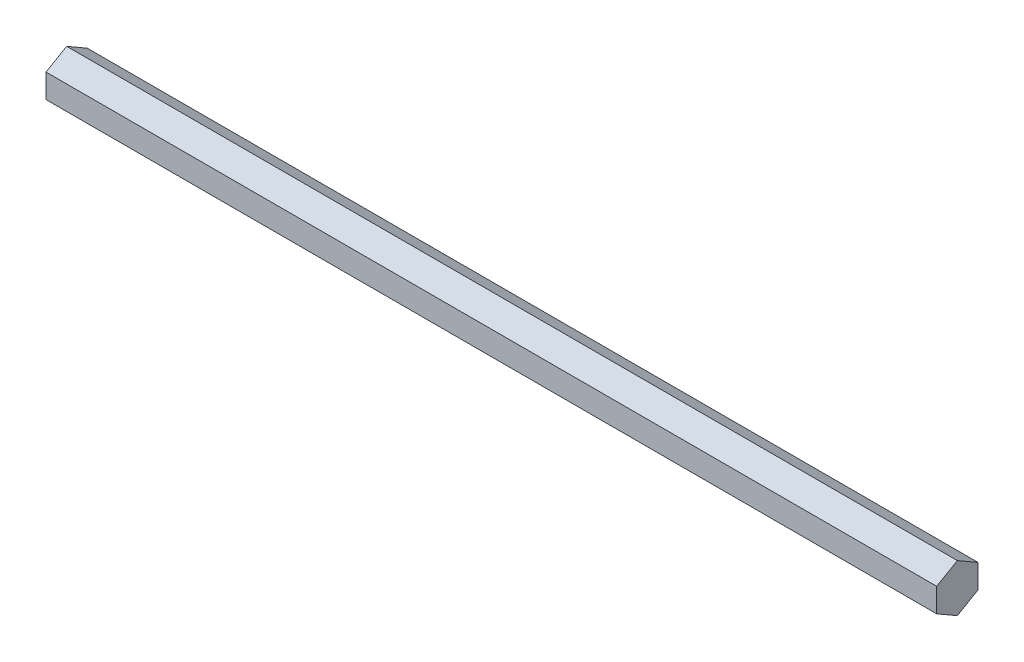
ISO-10303-21;
HEADER;
FILE_DESCRIPTION(('STEP AP214'),'2;1');
FILE_NAME('part.step','',(''),(''),'','','');
FILE_SCHEMA(('AUTOMOTIVE_DESIGN { 1 0 10303 214 1 1 1 1 }'));
ENDSEC;
DATA;
#1=APPLICATION_CONTEXT('core data for automotive mechanical design processes');
#2=APPLICATION_PROTOCOL_DEFINITION('international standard','automotive_design',2000,#1);
#3=PRODUCT_CONTEXT('',#1,'mechanical');
#4=PRODUCT('Part','Part','',(#3));
#5=PRODUCT_RELATED_PRODUCT_CATEGORY('part','',(#4));
#6=PRODUCT_DEFINITION_FORMATION('','',#4);
#7=PRODUCT_DEFINITION_CONTEXT('part definition',#1,'design');
#8=PRODUCT_DEFINITION('design','',#6,#7);
#9=PRODUCT_DEFINITION_SHAPE('','',#8);
#10=(LENGTH_UNIT() NAMED_UNIT(*) SI_UNIT(.MILLI.,.METRE.));
#11=(NAMED_UNIT(*) PLANE_ANGLE_UNIT() SI_UNIT($,.RADIAN.));
#12=(NAMED_UNIT(*) SI_UNIT($,.STERADIAN.) SOLID_ANGLE_UNIT());
#13=UNCERTAINTY_MEASURE_WITH_UNIT(LENGTH_MEASURE(1.E-05),#10,'distance_accuracy_value','');
#14=(GEOMETRIC_REPRESENTATION_CONTEXT(3) GLOBAL_UNCERTAINTY_ASSIGNED_CONTEXT((#13)) GLOBAL_UNIT_ASSIGNED_CONTEXT((#10,
#11,#12)) REPRESENTATION_CONTEXT('',''));
#15=CARTESIAN_POINT('',(0.,0.,0.));
#16=DIRECTION('',(0.,0.,1.));
#17=DIRECTION('',(1.,0.,0.));
#18=AXIS2_PLACEMENT_3D('',#15,#16,#17);
#19=CARTESIAN_POINT('',(177.8,-4.7625,0.));
#20=DIRECTION('',(0.,0.866025403784439,0.5));
#21=DIRECTION('',(0.,-0.5,0.866025403784439));
#22=AXIS2_PLACEMENT_3D('',#19,#20,#21);
#23=PLANE('',#22);
#24=DIRECTION('',(0.,0.499999999999999,-0.866025403784439));
#25=VECTOR('',#24,1.);
#26=CARTESIAN_POINT('',(0.,-4.7625,0.));
#27=LINE('',#26,#25);
#28=CARTESIAN_POINT('',(0.,-4.7625,0.));
#29=VERTEX_POINT('',#28);
#30=CARTESIAN_POINT('',(0.,-2.38125,-4.12444598552339));
#31=VERTEX_POINT('',#30);
#32=EDGE_CURVE('E146',#29,#31,#27,.T.);
#33=ORIENTED_EDGE('',*,*,#32,.T.);
#34=DIRECTION('',(-1.,0.,0.));
#35=VECTOR('',#34,1.);
#36=CARTESIAN_POINT('',(177.8,-2.38125,-4.12444598552339));
#37=LINE('',#36,#35);
#38=CARTESIAN_POINT('',(177.8,-2.38125,-4.12444598552339));
#39=VERTEX_POINT('',#38);
#40=EDGE_CURVE('E11',#39,#31,#37,.T.);
#41=ORIENTED_EDGE('',*,*,#40,.F.);
#42=DIRECTION('',(0.,0.499999999999999,-0.866025403784439));
#43=VECTOR('',#42,1.);
#44=CARTESIAN_POINT('',(177.8,-4.7625,0.));
#45=LINE('',#44,#43);
#46=CARTESIAN_POINT('',(177.8,-4.7625,0.));
#47=VERTEX_POINT('',#46);
#48=EDGE_CURVE('E164',#47,#39,#45,.T.);
#49=ORIENTED_EDGE('',*,*,#48,.F.);
#50=DIRECTION('',(-1.,0.,0.));
#51=VECTOR('',#50,1.);
#52=CARTESIAN_POINT('',(177.8,-4.7625,0.));
#53=LINE('',#52,#51);
#54=EDGE_CURVE('E142',#47,#29,#53,.T.);
#55=ORIENTED_EDGE('',*,*,#54,.T.);
#56=EDGE_LOOP('',(#33,#41,#49,#55));
#57=FACE_BOUND('',#56,.T.);
#58=ADVANCED_FACE('F45',(#57),#23,.F.);
#59=CARTESIAN_POINT('',(177.8,-2.38125,-4.12444598552339));
#60=DIRECTION('',(0.,0.,1.));
#61=DIRECTION('',(1.,0.,0.));
#62=AXIS2_PLACEMENT_3D('',#59,#60,#61);
#63=PLANE('',#62);
#64=DIRECTION('',(0.,1.,0.));
#65=VECTOR('',#64,1.);
#66=CARTESIAN_POINT('',(0.,-2.38125,-4.12444598552339));
#67=LINE('',#66,#65);
#68=CARTESIAN_POINT('',(0.,2.38125,-4.12444598552339));
#69=VERTEX_POINT('',#68);
#70=EDGE_CURVE('E150',#31,#69,#67,.T.);
#71=ORIENTED_EDGE('',*,*,#70,.T.);
#72=DIRECTION('',(-1.,0.,0.));
#73=VECTOR('',#72,1.);
#74=CARTESIAN_POINT('',(177.8,2.38125,-4.12444598552339));
#75=LINE('',#74,#73);
#76=CARTESIAN_POINT('',(177.8,2.38125,-4.12444598552339));
#77=VERTEX_POINT('',#76);
#78=EDGE_CURVE('E53',#77,#69,#75,.T.);
#79=ORIENTED_EDGE('',*,*,#78,.F.);
#80=DIRECTION('',(0.,1.,0.));
#81=VECTOR('',#80,1.);
#82=CARTESIAN_POINT('',(177.8,-2.38125,-4.12444598552339));
#83=LINE('',#82,#81);
#84=EDGE_CURVE('E104',#39,#77,#83,.T.);
#85=ORIENTED_EDGE('',*,*,#84,.F.);
#86=ORIENTED_EDGE('',*,*,#40,.T.);
#87=EDGE_LOOP('',(#71,#79,#85,#86));
#88=FACE_BOUND('',#87,.T.);
#89=ADVANCED_FACE('F228',(#88),#63,.F.);
#90=CARTESIAN_POINT('',(177.8,2.38125,-4.12444598552339));
#91=DIRECTION('',(0.,-0.866025403784439,0.5));
#92=DIRECTION('',(0.,-0.5,-0.866025403784439));
#93=AXIS2_PLACEMENT_3D('',#90,#91,#92);
#94=PLANE('',#93);
#95=DIRECTION('',(0.,0.5,0.866025403784439));
#96=VECTOR('',#95,1.);
#97=CARTESIAN_POINT('',(0.,2.38125,-4.12444598552339));
#98=LINE('',#97,#96);
#99=CARTESIAN_POINT('',(0.,4.7625,0.));
#100=VERTEX_POINT('',#99);
#101=EDGE_CURVE('E154',#69,#100,#98,.T.);
#102=ORIENTED_EDGE('',*,*,#101,.T.);
#103=DIRECTION('',(-1.,0.,0.));
#104=VECTOR('',#103,1.);
#105=CARTESIAN_POINT('',(177.8,4.7625,0.));
#106=LINE('',#105,#104);
#107=CARTESIAN_POINT('',(177.8,4.7625,0.));
#108=VERTEX_POINT('',#107);
#109=EDGE_CURVE('E135',#108,#100,#106,.T.);
#110=ORIENTED_EDGE('',*,*,#109,.F.);
#111=DIRECTION('',(0.,0.5,0.866025403784439));
#112=VECTOR('',#111,1.);
#113=CARTESIAN_POINT('',(177.8,2.38125,-4.12444598552339));
#114=LINE('',#113,#112);
#115=EDGE_CURVE('E121',#77,#108,#114,.T.);
#116=ORIENTED_EDGE('',*,*,#115,.F.);
#117=ORIENTED_EDGE('',*,*,#78,.T.);
#118=EDGE_LOOP('',(#102,#110,#116,#117));
#119=FACE_BOUND('',#118,.T.);
#120=ADVANCED_FACE('F174',(#119),#94,.F.);
#121=CARTESIAN_POINT('',(177.8,4.7625,0.));
#122=DIRECTION('',(0.,-0.866025403784439,-0.5));
#123=DIRECTION('',(0.,0.5,-0.866025403784439));
#124=AXIS2_PLACEMENT_3D('',#121,#122,#123);
#125=PLANE('',#124);
#126=DIRECTION('',(0.,-0.5,0.866025403784439));
#127=VECTOR('',#126,1.);
#128=CARTESIAN_POINT('',(0.,4.7625,0.));
#129=LINE('',#128,#127);
#130=CARTESIAN_POINT('',(0.,2.38125,4.12444598552339));
#131=VERTEX_POINT('',#130);
#132=EDGE_CURVE('E131',#100,#131,#129,.T.);
#133=ORIENTED_EDGE('',*,*,#132,.T.);
#134=DIRECTION('',(-1.,0.,0.));
#135=VECTOR('',#134,1.);
#136=CARTESIAN_POINT('',(177.8,2.38125,4.12444598552339));
#137=LINE('',#136,#135);
#138=CARTESIAN_POINT('',(177.8,2.38125,4.12444598552339));
#139=VERTEX_POINT('',#138);
#140=EDGE_CURVE('E128',#139,#131,#137,.T.);
#141=ORIENTED_EDGE('',*,*,#140,.F.);
#142=DIRECTION('',(0.,-0.5,0.866025403784439));
#143=VECTOR('',#142,1.);
#144=CARTESIAN_POINT('',(177.8,4.7625,0.));
#145=LINE('',#144,#143);
#146=EDGE_CURVE('E114',#108,#139,#145,.T.);
#147=ORIENTED_EDGE('',*,*,#146,.F.);
#148=ORIENTED_EDGE('',*,*,#109,.T.);
#149=EDGE_LOOP('',(#133,#141,#147,#148));
#150=FACE_BOUND('',#149,.T.);
#151=ADVANCED_FACE('F129',(#150),#125,.F.);
#152=CARTESIAN_POINT('',(177.8,2.38125,4.12444598552339));
#153=DIRECTION('',(0.,0.,-1.));
#154=DIRECTION('',(-1.,0.,0.));
#155=AXIS2_PLACEMENT_3D('',#152,#153,#154);
#156=PLANE('',#155);
#157=DIRECTION('',(0.,-1.,0.));
#158=VECTOR('',#157,1.);
#159=CARTESIAN_POINT('',(0.,2.38125,4.12444598552339));
#160=LINE('',#159,#158);
#161=CARTESIAN_POINT('',(0.,-2.38125,4.12444598552339));
#162=VERTEX_POINT('',#161);
#163=EDGE_CURVE('E159',#131,#162,#160,.T.);
#164=ORIENTED_EDGE('',*,*,#163,.T.);
#165=DIRECTION('',(-1.,0.,0.));
#166=VECTOR('',#165,1.);
#167=CARTESIAN_POINT('',(177.8,-2.38125,4.12444598552339));
#168=LINE('',#167,#166);
#169=CARTESIAN_POINT('',(177.8,-2.38125,4.12444598552339));
#170=VERTEX_POINT('',#169);
#171=EDGE_CURVE('E136',#170,#162,#168,.T.);
#172=ORIENTED_EDGE('',*,*,#171,.F.);
#173=DIRECTION('',(0.,-1.,0.));
#174=VECTOR('',#173,1.);
#175=CARTESIAN_POINT('',(177.8,2.38125,4.12444598552339));
#176=LINE('',#175,#174);
#177=EDGE_CURVE('E118',#139,#170,#176,.T.);
#178=ORIENTED_EDGE('',*,*,#177,.F.);
#179=ORIENTED_EDGE('',*,*,#140,.T.);
#180=EDGE_LOOP('',(#164,#172,#178,#179));
#181=FACE_BOUND('',#180,.T.);
#182=ADVANCED_FACE('F138',(#181),#156,.F.);
#183=CARTESIAN_POINT('',(177.8,-2.38125,4.12444598552339));
#184=DIRECTION('',(0.,0.866025403784439,-0.5));
#185=DIRECTION('',(0.,0.5,0.866025403784439));
#186=AXIS2_PLACEMENT_3D('',#183,#184,#185);
#187=PLANE('',#186);
#188=DIRECTION('',(0.,-0.5,-0.866025403784439));
#189=VECTOR('',#188,1.);
#190=CARTESIAN_POINT('',(0.,-2.38125,4.12444598552339));
#191=LINE('',#190,#189);
#192=EDGE_CURVE('E96',#162,#29,#191,.T.);
#193=ORIENTED_EDGE('',*,*,#192,.T.);
#194=ORIENTED_EDGE('',*,*,#54,.F.);
#195=DIRECTION('',(0.,-0.5,-0.866025403784439));
#196=VECTOR('',#195,1.);
#197=CARTESIAN_POINT('',(177.8,-2.38125,4.12444598552339));
#198=LINE('',#197,#196);
#199=EDGE_CURVE('E69',#170,#47,#198,.T.);
#200=ORIENTED_EDGE('',*,*,#199,.F.);
#201=ORIENTED_EDGE('',*,*,#171,.T.);
#202=EDGE_LOOP('',(#193,#194,#200,#201));
#203=FACE_BOUND('',#202,.T.);
#204=ADVANCED_FACE('F178',(#203),#187,.F.);
#205=CARTESIAN_POINT('',(177.8,0.,0.));
#206=DIRECTION('',(1.,0.,0.));
#207=DIRECTION('',(0.,0.,-1.));
#208=AXIS2_PLACEMENT_3D('',#205,#206,#207);
#209=PLANE('',#208);
#210=ORIENTED_EDGE('',*,*,#48,.T.);
#211=ORIENTED_EDGE('',*,*,#84,.T.);
#212=ORIENTED_EDGE('',*,*,#115,.T.);
#213=ORIENTED_EDGE('',*,*,#146,.T.);
#214=ORIENTED_EDGE('',*,*,#177,.T.);
#215=ORIENTED_EDGE('',*,*,#199,.T.);
#216=EDGE_LOOP('',(#210,#211,#212,#213,#214,#215));
#217=FACE_BOUND('',#216,.T.);
#218=ADVANCED_FACE('F116',(#217),#209,.T.);
#219=CARTESIAN_POINT('',(0.,0.,0.));
#220=DIRECTION('',(1.,0.,0.));
#221=DIRECTION('',(0.,0.,-1.));
#222=AXIS2_PLACEMENT_3D('',#219,#220,#221);
#223=PLANE('',#222);
#224=DIRECTION('',(0.,0.,-1.));
#225=VECTOR('',#224,1.);
#226=CARTESIAN_POINT('',(0.,2.4892,-1.66945835527575));
#227=LINE('',#226,#225);
#228=CARTESIAN_POINT('',(0.,2.4892,1.66945835527575));
#229=VERTEX_POINT('',#228);
#230=CARTESIAN_POINT('',(0.,2.4892,-1.66945835527575));
#231=VERTEX_POINT('',#230);
#232=EDGE_CURVE('E194',#229,#231,#227,.T.);
#233=ORIENTED_EDGE('',*,*,#232,.F.);
#234=CARTESIAN_POINT('',(0.,0.,0.));
#235=DIRECTION('',(-1.,0.,0.));
#236=DIRECTION('',(0.,0.,1.));
#237=AXIS2_PLACEMENT_3D('',#234,#235,#236);
#238=CIRCLE('',#237,2.9972);
#239=EDGE_CURVE('E60',#231,#229,#238,.T.);
#240=ORIENTED_EDGE('',*,*,#239,.F.);
#241=EDGE_LOOP('',(#233,#240));
#242=FACE_BOUND('',#241,.T.);
#243=ORIENTED_EDGE('',*,*,#32,.F.);
#244=ORIENTED_EDGE('',*,*,#192,.F.);
#245=ORIENTED_EDGE('',*,*,#163,.F.);
#246=ORIENTED_EDGE('',*,*,#132,.F.);
#247=ORIENTED_EDGE('',*,*,#101,.F.);
#248=ORIENTED_EDGE('',*,*,#70,.F.);
#249=EDGE_LOOP('',(#243,#244,#245,#246,#247,#248));
#250=FACE_BOUND('',#249,.T.);
#251=ADVANCED_FACE('F177',(#242,#250),#223,.F.);
#252=CARTESIAN_POINT('',(13.97,0.,0.));
#253=DIRECTION('',(-1.,0.,0.));
#254=DIRECTION('',(0.,0.,1.));
#255=AXIS2_PLACEMENT_3D('',#252,#253,#254);
#256=CYLINDRICAL_SURFACE('',#255,2.9972);
#257=ORIENTED_EDGE('',*,*,#239,.T.);
#258=DIRECTION('',(-1.,0.,0.));
#259=VECTOR('',#258,1.);
#260=CARTESIAN_POINT('',(13.97,2.4892,1.66945835527575));
#261=LINE('',#260,#259);
#262=CARTESIAN_POINT('',(13.97,2.4892,1.66945835527575));
#263=VERTEX_POINT('',#262);
#264=EDGE_CURVE('E187',#263,#229,#261,.T.);
#265=ORIENTED_EDGE('',*,*,#264,.F.);
#266=CARTESIAN_POINT('',(13.97,0.,0.));
#267=DIRECTION('',(-1.,0.,0.));
#268=DIRECTION('',(0.,0.,1.));
#269=AXIS2_PLACEMENT_3D('',#266,#267,#268);
#270=CIRCLE('',#269,2.9972);
#271=CARTESIAN_POINT('',(13.97,2.4892,-1.66945835527575));
#272=VERTEX_POINT('',#271);
#273=EDGE_CURVE('E198',#272,#263,#270,.T.);
#274=ORIENTED_EDGE('',*,*,#273,.F.);
#275=DIRECTION('',(-1.,0.,0.));
#276=VECTOR('',#275,1.);
#277=CARTESIAN_POINT('',(13.97,2.4892,-1.66945835527575));
#278=LINE('',#277,#276);
#279=EDGE_CURVE('E151',#272,#231,#278,.T.);
#280=ORIENTED_EDGE('',*,*,#279,.T.);
#281=EDGE_LOOP('',(#257,#265,#274,#280));
#282=FACE_BOUND('',#281,.T.);
#283=ADVANCED_FACE('F216',(#282),#256,.F.);
#284=CARTESIAN_POINT('',(13.97,2.4892,-1.66945835527575));
#285=DIRECTION('',(0.,1.,0.));
#286=DIRECTION('',(0.,0.,1.));
#287=AXIS2_PLACEMENT_3D('',#284,#285,#286);
#288=PLANE('',#287);
#289=ORIENTED_EDGE('',*,*,#232,.T.);
#290=ORIENTED_EDGE('',*,*,#279,.F.);
#291=DIRECTION('',(0.,0.,-1.));
#292=VECTOR('',#291,1.);
#293=CARTESIAN_POINT('',(13.97,2.4892,-1.66945835527575));
#294=LINE('',#293,#292);
#295=EDGE_CURVE('E191',#263,#272,#294,.T.);
#296=ORIENTED_EDGE('',*,*,#295,.F.);
#297=ORIENTED_EDGE('',*,*,#264,.T.);
#298=EDGE_LOOP('',(#289,#290,#296,#297));
#299=FACE_BOUND('',#298,.T.);
#300=ADVANCED_FACE('F214',(#299),#288,.F.);
#301=CARTESIAN_POINT('',(13.97,0.,0.));
#302=DIRECTION('',(-1.,0.,0.));
#303=DIRECTION('',(0.,0.,1.));
#304=AXIS2_PLACEMENT_3D('',#301,#302,#303);
#305=PLANE('',#304);
#306=ORIENTED_EDGE('',*,*,#273,.T.);
#307=ORIENTED_EDGE('',*,*,#295,.T.);
#308=EDGE_LOOP('',(#306,#307));
#309=FACE_BOUND('',#308,.T.);
#310=ADVANCED_FACE('F210',(#309),#305,.T.);
#311=CLOSED_SHELL('',(#58,#89,#120,#151,#182,#204,#218,#251,#283,#300,#310));
#312=MANIFOLD_SOLID_BREP('B2',#311);
#313=ADVANCED_BREP_SHAPE_REPRESENTATION('',(#18,#312),#14);
#314=SHAPE_DEFINITION_REPRESENTATION(#9,#313);
ENDSEC;
END-ISO-10303-21;
